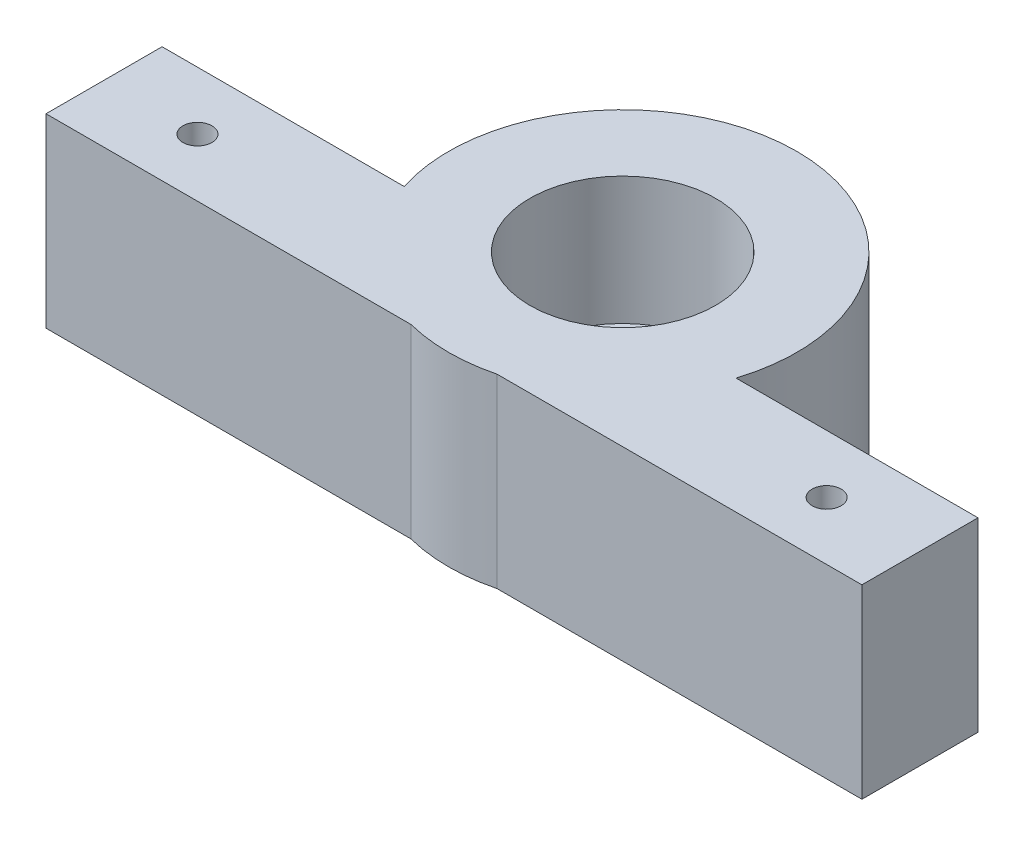
ISO-10303-21;
HEADER;
FILE_DESCRIPTION(('STEP AP214'),'2;1');
FILE_NAME('part.step','',(''),(''),'','','');
FILE_SCHEMA(('AUTOMOTIVE_DESIGN { 1 0 10303 214 1 1 1 1 }'));
ENDSEC;
DATA;
#1=APPLICATION_CONTEXT('core data for automotive mechanical design processes');
#2=APPLICATION_PROTOCOL_DEFINITION('international standard','automotive_design',2000,#1);
#3=PRODUCT_CONTEXT('',#1,'mechanical');
#4=PRODUCT('Part','Part','',(#3));
#5=PRODUCT_RELATED_PRODUCT_CATEGORY('part','',(#4));
#6=PRODUCT_DEFINITION_FORMATION('','',#4);
#7=PRODUCT_DEFINITION_CONTEXT('part definition',#1,'design');
#8=PRODUCT_DEFINITION('design','',#6,#7);
#9=PRODUCT_DEFINITION_SHAPE('','',#8);
#10=(LENGTH_UNIT() NAMED_UNIT(*) SI_UNIT(.MILLI.,.METRE.));
#11=(NAMED_UNIT(*) PLANE_ANGLE_UNIT() SI_UNIT($,.RADIAN.));
#12=(NAMED_UNIT(*) SI_UNIT($,.STERADIAN.) SOLID_ANGLE_UNIT());
#13=UNCERTAINTY_MEASURE_WITH_UNIT(LENGTH_MEASURE(1.E-05),#10,'distance_accuracy_value','');
#14=(GEOMETRIC_REPRESENTATION_CONTEXT(3) GLOBAL_UNCERTAINTY_ASSIGNED_CONTEXT((#13)) GLOBAL_UNIT_ASSIGNED_CONTEXT((#10,
#11,#12)) REPRESENTATION_CONTEXT('',''));
#15=CARTESIAN_POINT('',(0.,0.,0.));
#16=DIRECTION('',(0.,0.,1.));
#17=DIRECTION('',(1.,0.,0.));
#18=AXIS2_PLACEMENT_3D('',#15,#16,#17);
#19=CARTESIAN_POINT('',(0.,8.,0.));
#20=DIRECTION('',(0.,-1.,0.));
#21=DIRECTION('',(0.,0.,-1.));
#22=AXIS2_PLACEMENT_3D('',#19,#20,#21);
#23=CYLINDRICAL_SURFACE('',#22,1.875);
#24=CARTESIAN_POINT('',(0.,0.,0.));
#25=DIRECTION('',(0.,1.,0.));
#26=DIRECTION('',(0.,0.,1.));
#27=AXIS2_PLACEMENT_3D('',#24,#25,#26);
#28=CIRCLE('',#27,1.875);
#29=CARTESIAN_POINT('',(0.,0.,1.875));
#30=VERTEX_POINT('',#29);
#31=EDGE_CURVE('E136',#30,#30,#28,.T.);
#32=ORIENTED_EDGE('',*,*,#31,.F.);
#33=EDGE_LOOP('',(#32));
#34=FACE_BOUND('',#33,.T.);
#35=CARTESIAN_POINT('',(0.,2.5,0.));
#36=DIRECTION('',(0.,1.,0.));
#37=DIRECTION('',(0.,0.,1.));
#38=AXIS2_PLACEMENT_3D('',#35,#36,#37);
#39=CIRCLE('',#38,1.875);
#40=CARTESIAN_POINT('',(0.,2.5,1.875));
#41=VERTEX_POINT('',#40);
#42=EDGE_CURVE('E37',#41,#41,#39,.T.);
#43=ORIENTED_EDGE('',*,*,#42,.T.);
#44=EDGE_LOOP('',(#43));
#45=FACE_BOUND('',#44,.T.);
#46=ADVANCED_FACE('F33',(#34,#45),#23,.F.);
#47=CARTESIAN_POINT('',(0.,8.,0.));
#48=DIRECTION('',(0.,1.,0.));
#49=DIRECTION('',(0.,0.,1.));
#50=AXIS2_PLACEMENT_3D('',#47,#48,#49);
#51=PLANE('',#50);
#52=CARTESIAN_POINT('',(0.,8.,0.));
#53=DIRECTION('',(0.,1.,0.));
#54=DIRECTION('',(0.,0.,1.));
#55=AXIS2_PLACEMENT_3D('',#52,#53,#54);
#56=CIRCLE('',#55,4.);
#57=CARTESIAN_POINT('',(0.,8.,4.));
#58=VERTEX_POINT('',#57);
#59=EDGE_CURVE('E196',#58,#58,#56,.T.);
#60=ORIENTED_EDGE('',*,*,#59,.F.);
#61=EDGE_LOOP('',(#60));
#62=FACE_BOUND('',#61,.T.);
#63=CARTESIAN_POINT('',(-13.55,8.,4.76772943389164));
#64=DIRECTION('',(0.,1.,0.));
#65=DIRECTION('',(0.,0.,1.));
#66=AXIS2_PLACEMENT_3D('',#63,#64,#65);
#67=CIRCLE('',#66,0.625000000000001);
#68=CARTESIAN_POINT('',(-13.55,8.,5.39272943389165));
#69=VERTEX_POINT('',#68);
#70=EDGE_CURVE('E184',#69,#69,#67,.T.);
#71=ORIENTED_EDGE('',*,*,#70,.F.);
#72=EDGE_LOOP('',(#71));
#73=FACE_BOUND('',#72,.T.);
#74=CARTESIAN_POINT('',(0.,8.,0.));
#75=DIRECTION('',(0.,1.,0.));
#76=DIRECTION('',(0.,0.,1.));
#77=AXIS2_PLACEMENT_3D('',#74,#75,#76);
#78=CIRCLE('',#77,7.5);
#79=CARTESIAN_POINT('',(-1.85205531120024,8.,7.26772943389164));
#80=VERTEX_POINT('',#79);
#81=CARTESIAN_POINT('',(1.85205531120024,8.,7.26772943389164));
#82=VERTEX_POINT('',#81);
#83=EDGE_CURVE('E147',#80,#82,#78,.T.);
#84=ORIENTED_EDGE('',*,*,#83,.T.);
#85=DIRECTION('',(1.,0.,0.));
#86=VECTOR('',#85,1.);
#87=CARTESIAN_POINT('',(17.5696170458769,8.,7.26772943389164));
#88=LINE('',#87,#86);
#89=CARTESIAN_POINT('',(17.5696170458769,8.,7.26772943389164));
#90=VERTEX_POINT('',#89);
#91=EDGE_CURVE('E94',#82,#90,#88,.T.);
#92=ORIENTED_EDGE('',*,*,#91,.T.);
#93=DIRECTION('',(0.,0.,-1.));
#94=VECTOR('',#93,1.);
#95=CARTESIAN_POINT('',(17.5696170458769,8.,2.26772943389165));
#96=LINE('',#95,#94);
#97=CARTESIAN_POINT('',(17.5696170458769,8.,2.26772943389165));
#98=VERTEX_POINT('',#97);
#99=EDGE_CURVE('E163',#90,#98,#96,.T.);
#100=ORIENTED_EDGE('',*,*,#99,.T.);
#101=DIRECTION('',(-1.,0.,0.));
#102=VECTOR('',#101,1.);
#103=CARTESIAN_POINT('',(7.14894420279397,8.,2.26772943389165));
#104=LINE('',#103,#102);
#105=CARTESIAN_POINT('',(7.14894420279397,8.,2.26772943389165));
#106=VERTEX_POINT('',#105);
#107=EDGE_CURVE('E176',#98,#106,#104,.T.);
#108=ORIENTED_EDGE('',*,*,#107,.T.);
#109=CARTESIAN_POINT('',(0.,8.,0.));
#110=DIRECTION('',(0.,1.,0.));
#111=DIRECTION('',(0.,0.,1.));
#112=AXIS2_PLACEMENT_3D('',#109,#110,#111);
#113=CIRCLE('',#112,7.5);
#114=CARTESIAN_POINT('',(-7.14894420279397,8.,2.26772943389165));
#115=VERTEX_POINT('',#114);
#116=EDGE_CURVE('E114',#106,#115,#113,.T.);
#117=ORIENTED_EDGE('',*,*,#116,.T.);
#118=DIRECTION('',(-1.,0.,0.));
#119=VECTOR('',#118,1.);
#120=CARTESIAN_POINT('',(-7.14894420279397,8.,2.26772943389165));
#121=LINE('',#120,#119);
#122=CARTESIAN_POINT('',(-17.572518577854,8.,2.26772943389165));
#123=VERTEX_POINT('',#122);
#124=EDGE_CURVE('E107',#115,#123,#121,.T.);
#125=ORIENTED_EDGE('',*,*,#124,.T.);
#126=DIRECTION('',(0.,0.,1.));
#127=VECTOR('',#126,1.);
#128=CARTESIAN_POINT('',(-17.572518577854,8.,2.26772943389165));
#129=LINE('',#128,#127);
#130=CARTESIAN_POINT('',(-17.572518577854,8.,7.26772943389165));
#131=VERTEX_POINT('',#130);
#132=EDGE_CURVE('E112',#123,#131,#129,.T.);
#133=ORIENTED_EDGE('',*,*,#132,.T.);
#134=DIRECTION('',(1.,0.,0.));
#135=VECTOR('',#134,1.);
#136=CARTESIAN_POINT('',(-17.572518577854,8.,7.26772943389165));
#137=LINE('',#136,#135);
#138=EDGE_CURVE('E51',#131,#80,#137,.T.);
#139=ORIENTED_EDGE('',*,*,#138,.T.);
#140=EDGE_LOOP('',(#84,#92,#100,#108,#117,#125,#133,#139));
#141=FACE_BOUND('',#140,.T.);
#142=CARTESIAN_POINT('',(13.55,8.,4.76772943389164));
#143=DIRECTION('',(0.,1.,0.));
#144=DIRECTION('',(0.,0.,1.));
#145=AXIS2_PLACEMENT_3D('',#142,#143,#144);
#146=CIRCLE('',#145,0.625000000000001);
#147=CARTESIAN_POINT('',(13.55,8.,5.39272943389165));
#148=VERTEX_POINT('',#147);
#149=EDGE_CURVE('E188',#148,#148,#146,.T.);
#150=ORIENTED_EDGE('',*,*,#149,.F.);
#151=EDGE_LOOP('',(#150));
#152=FACE_BOUND('',#151,.T.);
#153=ADVANCED_FACE('F109',(#62,#73,#141,#152),#51,.T.);
#154=CARTESIAN_POINT('',(0.,0.,0.));
#155=DIRECTION('',(0.,1.,0.));
#156=DIRECTION('',(0.,0.,1.));
#157=AXIS2_PLACEMENT_3D('',#154,#155,#156);
#158=PLANE('',#157);
#159=CARTESIAN_POINT('',(-13.55,0.,4.76772943389164));
#160=DIRECTION('',(0.,1.,0.));
#161=DIRECTION('',(0.,0.,1.));
#162=AXIS2_PLACEMENT_3D('',#159,#160,#161);
#163=CIRCLE('',#162,0.625000000000001);
#164=CARTESIAN_POINT('',(-13.55,0.,5.39272943389165));
#165=VERTEX_POINT('',#164);
#166=EDGE_CURVE('E185',#165,#165,#163,.T.);
#167=ORIENTED_EDGE('',*,*,#166,.T.);
#168=EDGE_LOOP('',(#167));
#169=FACE_BOUND('',#168,.T.);
#170=CARTESIAN_POINT('',(0.,0.,0.));
#171=DIRECTION('',(0.,1.,0.));
#172=DIRECTION('',(0.,0.,1.));
#173=AXIS2_PLACEMENT_3D('',#170,#171,#172);
#174=CIRCLE('',#173,7.5);
#175=CARTESIAN_POINT('',(-1.85205531120024,0.,7.26772943389164));
#176=VERTEX_POINT('',#175);
#177=CARTESIAN_POINT('',(1.85205531120024,0.,7.26772943389164));
#178=VERTEX_POINT('',#177);
#179=EDGE_CURVE('E132',#176,#178,#174,.T.);
#180=ORIENTED_EDGE('',*,*,#179,.F.);
#181=DIRECTION('',(1.,0.,0.));
#182=VECTOR('',#181,1.);
#183=CARTESIAN_POINT('',(-17.572518577854,0.,7.26772943389165));
#184=LINE('',#183,#182);
#185=CARTESIAN_POINT('',(-17.572518577854,0.,7.26772943389165));
#186=VERTEX_POINT('',#185);
#187=EDGE_CURVE('E86',#186,#176,#184,.T.);
#188=ORIENTED_EDGE('',*,*,#187,.F.);
#189=DIRECTION('',(0.,0.,1.));
#190=VECTOR('',#189,1.);
#191=CARTESIAN_POINT('',(-17.572518577854,0.,2.26772943389165));
#192=LINE('',#191,#190);
#193=CARTESIAN_POINT('',(-17.572518577854,0.,2.26772943389165));
#194=VERTEX_POINT('',#193);
#195=EDGE_CURVE('E80',#194,#186,#192,.T.);
#196=ORIENTED_EDGE('',*,*,#195,.F.);
#197=DIRECTION('',(-1.,0.,0.));
#198=VECTOR('',#197,1.);
#199=CARTESIAN_POINT('',(-7.14894420279397,0.,2.26772943389165));
#200=LINE('',#199,#198);
#201=CARTESIAN_POINT('',(-7.14894420279397,0.,2.26772943389165));
#202=VERTEX_POINT('',#201);
#203=EDGE_CURVE('E122',#202,#194,#200,.T.);
#204=ORIENTED_EDGE('',*,*,#203,.F.);
#205=CARTESIAN_POINT('',(0.,0.,0.));
#206=DIRECTION('',(0.,1.,0.));
#207=DIRECTION('',(0.,0.,1.));
#208=AXIS2_PLACEMENT_3D('',#205,#206,#207);
#209=CIRCLE('',#208,7.5);
#210=CARTESIAN_POINT('',(7.14894420279397,0.,2.26772943389165));
#211=VERTEX_POINT('',#210);
#212=EDGE_CURVE('E142',#211,#202,#209,.T.);
#213=ORIENTED_EDGE('',*,*,#212,.F.);
#214=DIRECTION('',(-1.,0.,0.));
#215=VECTOR('',#214,1.);
#216=CARTESIAN_POINT('',(7.14894420279397,0.,2.26772943389165));
#217=LINE('',#216,#215);
#218=CARTESIAN_POINT('',(17.5696170458769,0.,2.26772943389165));
#219=VERTEX_POINT('',#218);
#220=EDGE_CURVE('E140',#219,#211,#217,.T.);
#221=ORIENTED_EDGE('',*,*,#220,.F.);
#222=DIRECTION('',(0.,0.,-1.));
#223=VECTOR('',#222,1.);
#224=CARTESIAN_POINT('',(17.5696170458769,0.,2.26772943389165));
#225=LINE('',#224,#223);
#226=CARTESIAN_POINT('',(17.5696170458769,0.,7.26772943389164));
#227=VERTEX_POINT('',#226);
#228=EDGE_CURVE('E138',#227,#219,#225,.T.);
#229=ORIENTED_EDGE('',*,*,#228,.F.);
#230=DIRECTION('',(1.,0.,0.));
#231=VECTOR('',#230,1.);
#232=CARTESIAN_POINT('',(17.5696170458769,0.,7.26772943389164));
#233=LINE('',#232,#231);
#234=EDGE_CURVE('E135',#178,#227,#233,.T.);
#235=ORIENTED_EDGE('',*,*,#234,.F.);
#236=EDGE_LOOP('',(#180,#188,#196,#204,#213,#221,#229,#235));
#237=FACE_BOUND('',#236,.T.);
#238=ORIENTED_EDGE('',*,*,#31,.T.);
#239=EDGE_LOOP('',(#238));
#240=FACE_BOUND('',#239,.T.);
#241=CARTESIAN_POINT('',(13.55,0.,4.76772943389164));
#242=DIRECTION('',(0.,1.,0.));
#243=DIRECTION('',(0.,0.,1.));
#244=AXIS2_PLACEMENT_3D('',#241,#242,#243);
#245=CIRCLE('',#244,0.625000000000001);
#246=CARTESIAN_POINT('',(13.55,0.,5.39272943389165));
#247=VERTEX_POINT('',#246);
#248=EDGE_CURVE('E191',#247,#247,#245,.T.);
#249=ORIENTED_EDGE('',*,*,#248,.T.);
#250=EDGE_LOOP('',(#249));
#251=FACE_BOUND('',#250,.T.);
#252=ADVANCED_FACE('F167',(#169,#237,#240,#251),#158,.F.);
#253=CARTESIAN_POINT('',(0.,8.,0.));
#254=DIRECTION('',(0.,-1.,0.));
#255=DIRECTION('',(0.,0.,-1.));
#256=AXIS2_PLACEMENT_3D('',#253,#254,#255);
#257=CYLINDRICAL_SURFACE('',#256,7.5);
#258=ORIENTED_EDGE('',*,*,#179,.T.);
#259=DIRECTION('',(0.,-1.,0.));
#260=VECTOR('',#259,1.);
#261=CARTESIAN_POINT('',(1.85205531120024,8.,7.26772943389164));
#262=LINE('',#261,#260);
#263=EDGE_CURVE('E11',#82,#178,#262,.T.);
#264=ORIENTED_EDGE('',*,*,#263,.F.);
#265=ORIENTED_EDGE('',*,*,#83,.F.);
#266=DIRECTION('',(0.,-1.,0.));
#267=VECTOR('',#266,1.);
#268=CARTESIAN_POINT('',(-1.85205531120024,8.,7.26772943389164));
#269=LINE('',#268,#267);
#270=EDGE_CURVE('E128',#80,#176,#269,.T.);
#271=ORIENTED_EDGE('',*,*,#270,.T.);
#272=EDGE_LOOP('',(#258,#264,#265,#271));
#273=FACE_BOUND('',#272,.T.);
#274=ADVANCED_FACE('F35',(#273),#257,.T.);
#275=CARTESIAN_POINT('',(17.5696170458769,8.,7.26772943389164));
#276=DIRECTION('',(0.,0.,-1.));
#277=DIRECTION('',(-1.,0.,0.));
#278=AXIS2_PLACEMENT_3D('',#275,#276,#277);
#279=PLANE('',#278);
#280=ORIENTED_EDGE('',*,*,#234,.T.);
#281=DIRECTION('',(0.,-1.,0.));
#282=VECTOR('',#281,1.);
#283=CARTESIAN_POINT('',(17.5696170458769,8.,7.26772943389164));
#284=LINE('',#283,#282);
#285=EDGE_CURVE('E43',#90,#227,#284,.T.);
#286=ORIENTED_EDGE('',*,*,#285,.F.);
#287=ORIENTED_EDGE('',*,*,#91,.F.);
#288=ORIENTED_EDGE('',*,*,#263,.T.);
#289=EDGE_LOOP('',(#280,#286,#287,#288));
#290=FACE_BOUND('',#289,.T.);
#291=ADVANCED_FACE('F245',(#290),#279,.F.);
#292=CARTESIAN_POINT('',(17.5696170458769,8.,2.26772943389165));
#293=DIRECTION('',(-1.,0.,0.));
#294=DIRECTION('',(0.,0.,1.));
#295=AXIS2_PLACEMENT_3D('',#292,#293,#294);
#296=PLANE('',#295);
#297=ORIENTED_EDGE('',*,*,#228,.T.);
#298=DIRECTION('',(0.,-1.,0.));
#299=VECTOR('',#298,1.);
#300=CARTESIAN_POINT('',(17.5696170458769,8.,2.26772943389165));
#301=LINE('',#300,#299);
#302=EDGE_CURVE('E154',#98,#219,#301,.T.);
#303=ORIENTED_EDGE('',*,*,#302,.F.);
#304=ORIENTED_EDGE('',*,*,#99,.F.);
#305=ORIENTED_EDGE('',*,*,#285,.T.);
#306=EDGE_LOOP('',(#297,#303,#304,#305));
#307=FACE_BOUND('',#306,.T.);
#308=ADVANCED_FACE('F161',(#307),#296,.F.);
#309=CARTESIAN_POINT('',(7.14894420279397,8.,2.26772943389165));
#310=DIRECTION('',(0.,0.,1.));
#311=DIRECTION('',(1.,0.,0.));
#312=AXIS2_PLACEMENT_3D('',#309,#310,#311);
#313=PLANE('',#312);
#314=ORIENTED_EDGE('',*,*,#220,.T.);
#315=DIRECTION('',(0.,-1.,0.));
#316=VECTOR('',#315,1.);
#317=CARTESIAN_POINT('',(7.14894420279397,8.,2.26772943389165));
#318=LINE('',#317,#316);
#319=EDGE_CURVE('E151',#106,#211,#318,.T.);
#320=ORIENTED_EDGE('',*,*,#319,.F.);
#321=ORIENTED_EDGE('',*,*,#107,.F.);
#322=ORIENTED_EDGE('',*,*,#302,.T.);
#323=EDGE_LOOP('',(#314,#320,#321,#322));
#324=FACE_BOUND('',#323,.T.);
#325=ADVANCED_FACE('F172',(#324),#313,.F.);
#326=CARTESIAN_POINT('',(0.,8.,0.));
#327=DIRECTION('',(0.,-1.,0.));
#328=DIRECTION('',(0.,0.,-1.));
#329=AXIS2_PLACEMENT_3D('',#326,#327,#328);
#330=CYLINDRICAL_SURFACE('',#329,7.5);
#331=ORIENTED_EDGE('',*,*,#212,.T.);
#332=DIRECTION('',(0.,-1.,0.));
#333=VECTOR('',#332,1.);
#334=CARTESIAN_POINT('',(-7.14894420279397,8.,2.26772943389165));
#335=LINE('',#334,#333);
#336=EDGE_CURVE('E123',#115,#202,#335,.T.);
#337=ORIENTED_EDGE('',*,*,#336,.F.);
#338=ORIENTED_EDGE('',*,*,#116,.F.);
#339=ORIENTED_EDGE('',*,*,#319,.T.);
#340=EDGE_LOOP('',(#331,#337,#338,#339));
#341=FACE_BOUND('',#340,.T.);
#342=ADVANCED_FACE('F175',(#341),#330,.T.);
#343=CARTESIAN_POINT('',(-7.14894420279397,8.,2.26772943389165));
#344=DIRECTION('',(0.,0.,1.));
#345=DIRECTION('',(1.,0.,0.));
#346=AXIS2_PLACEMENT_3D('',#343,#344,#345);
#347=PLANE('',#346);
#348=ORIENTED_EDGE('',*,*,#203,.T.);
#349=DIRECTION('',(0.,-1.,0.));
#350=VECTOR('',#349,1.);
#351=CARTESIAN_POINT('',(-17.572518577854,8.,2.26772943389165));
#352=LINE('',#351,#350);
#353=EDGE_CURVE('E119',#123,#194,#352,.T.);
#354=ORIENTED_EDGE('',*,*,#353,.F.);
#355=ORIENTED_EDGE('',*,*,#124,.F.);
#356=ORIENTED_EDGE('',*,*,#336,.T.);
#357=EDGE_LOOP('',(#348,#354,#355,#356));
#358=FACE_BOUND('',#357,.T.);
#359=ADVANCED_FACE('F120',(#358),#347,.F.);
#360=CARTESIAN_POINT('',(-17.572518577854,8.,2.26772943389165));
#361=DIRECTION('',(1.,0.,0.));
#362=DIRECTION('',(0.,0.,-1.));
#363=AXIS2_PLACEMENT_3D('',#360,#361,#362);
#364=PLANE('',#363);
#365=ORIENTED_EDGE('',*,*,#195,.T.);
#366=DIRECTION('',(0.,-1.,0.));
#367=VECTOR('',#366,1.);
#368=CARTESIAN_POINT('',(-17.572518577854,8.,7.26772943389165));
#369=LINE('',#368,#367);
#370=EDGE_CURVE('E124',#131,#186,#369,.T.);
#371=ORIENTED_EDGE('',*,*,#370,.F.);
#372=ORIENTED_EDGE('',*,*,#132,.F.);
#373=ORIENTED_EDGE('',*,*,#353,.T.);
#374=EDGE_LOOP('',(#365,#371,#372,#373));
#375=FACE_BOUND('',#374,.T.);
#376=ADVANCED_FACE('F126',(#375),#364,.F.);
#377=CARTESIAN_POINT('',(-17.572518577854,8.,7.26772943389165));
#378=DIRECTION('',(0.,0.,-1.));
#379=DIRECTION('',(-1.,0.,0.));
#380=AXIS2_PLACEMENT_3D('',#377,#378,#379);
#381=PLANE('',#380);
#382=ORIENTED_EDGE('',*,*,#187,.T.);
#383=ORIENTED_EDGE('',*,*,#270,.F.);
#384=ORIENTED_EDGE('',*,*,#138,.F.);
#385=ORIENTED_EDGE('',*,*,#370,.T.);
#386=EDGE_LOOP('',(#382,#383,#384,#385));
#387=FACE_BOUND('',#386,.T.);
#388=ADVANCED_FACE('F233',(#387),#381,.F.);
#389=CARTESIAN_POINT('',(-13.55,8.,4.76772943389164));
#390=DIRECTION('',(0.,-1.,0.));
#391=DIRECTION('',(0.,0.,-1.));
#392=AXIS2_PLACEMENT_3D('',#389,#390,#391);
#393=CYLINDRICAL_SURFACE('',#392,0.625000000000001);
#394=ORIENTED_EDGE('',*,*,#70,.T.);
#395=EDGE_LOOP('',(#394));
#396=FACE_BOUND('',#395,.T.);
#397=ORIENTED_EDGE('',*,*,#166,.F.);
#398=EDGE_LOOP('',(#397));
#399=FACE_BOUND('',#398,.T.);
#400=ADVANCED_FACE('F227',(#396,#399),#393,.F.);
#401=CARTESIAN_POINT('',(13.55,8.,4.76772943389164));
#402=DIRECTION('',(0.,-1.,0.));
#403=DIRECTION('',(0.,0.,-1.));
#404=AXIS2_PLACEMENT_3D('',#401,#402,#403);
#405=CYLINDRICAL_SURFACE('',#404,0.625000000000001);
#406=ORIENTED_EDGE('',*,*,#149,.T.);
#407=EDGE_LOOP('',(#406));
#408=FACE_BOUND('',#407,.T.);
#409=ORIENTED_EDGE('',*,*,#248,.F.);
#410=EDGE_LOOP('',(#409));
#411=FACE_BOUND('',#410,.T.);
#412=ADVANCED_FACE('F214',(#408,#411),#405,.F.);
#413=CARTESIAN_POINT('',(0.,2.5,0.));
#414=DIRECTION('',(0.,1.,0.));
#415=DIRECTION('',(0.,0.,1.));
#416=AXIS2_PLACEMENT_3D('',#413,#414,#415);
#417=CYLINDRICAL_SURFACE('',#416,4.);
#418=CARTESIAN_POINT('',(0.,2.5,0.));
#419=DIRECTION('',(0.,1.,0.));
#420=DIRECTION('',(0.,0.,1.));
#421=AXIS2_PLACEMENT_3D('',#418,#419,#420);
#422=CIRCLE('',#421,4.);
#423=CARTESIAN_POINT('',(0.,2.5,4.));
#424=VERTEX_POINT('',#423);
#425=EDGE_CURVE('E199',#424,#424,#422,.T.);
#426=ORIENTED_EDGE('',*,*,#425,.F.);
#427=EDGE_LOOP('',(#426));
#428=FACE_BOUND('',#427,.T.);
#429=ORIENTED_EDGE('',*,*,#59,.T.);
#430=EDGE_LOOP('',(#429));
#431=FACE_BOUND('',#430,.T.);
#432=ADVANCED_FACE('F209',(#428,#431),#417,.F.);
#433=CARTESIAN_POINT('',(0.,2.5,0.));
#434=DIRECTION('',(0.,1.,0.));
#435=DIRECTION('',(0.,0.,1.));
#436=AXIS2_PLACEMENT_3D('',#433,#434,#435);
#437=PLANE('',#436);
#438=ORIENTED_EDGE('',*,*,#42,.F.);
#439=EDGE_LOOP('',(#438));
#440=FACE_BOUND('',#439,.T.);
#441=ORIENTED_EDGE('',*,*,#425,.T.);
#442=EDGE_LOOP('',(#441));
#443=FACE_BOUND('',#442,.T.);
#444=ADVANCED_FACE('F207',(#440,#443),#437,.T.);
#445=CLOSED_SHELL('',(#46,#153,#252,#274,#291,#308,#325,#342,#359,#376,#388,#400,#412,#432,#444));
#446=MANIFOLD_SOLID_BREP('B2',#445);
#447=ADVANCED_BREP_SHAPE_REPRESENTATION('',(#18,#446),#14);
#448=SHAPE_DEFINITION_REPRESENTATION(#9,#447);
ENDSEC;
END-ISO-10303-21;
